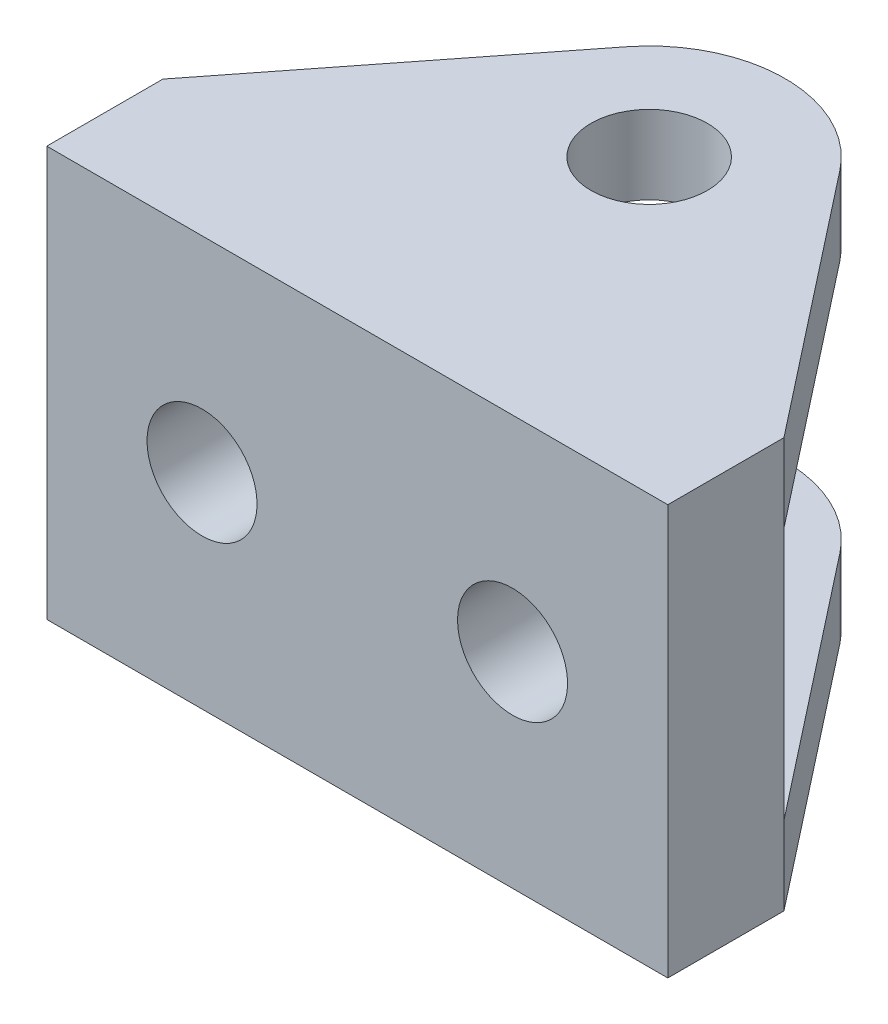
ISO-10303-21;
HEADER;
FILE_DESCRIPTION(('STEP AP214'),'2;1');
FILE_NAME('part.step','',(''),(''),'','','');
FILE_SCHEMA(('AUTOMOTIVE_DESIGN { 1 0 10303 214 1 1 1 1 }'));
ENDSEC;
DATA;
#1=APPLICATION_CONTEXT('core data for automotive mechanical design processes');
#2=APPLICATION_PROTOCOL_DEFINITION('international standard','automotive_design',2000,#1);
#3=PRODUCT_CONTEXT('',#1,'mechanical');
#4=PRODUCT('Part','Part','',(#3));
#5=PRODUCT_RELATED_PRODUCT_CATEGORY('part','',(#4));
#6=PRODUCT_DEFINITION_FORMATION('','',#4);
#7=PRODUCT_DEFINITION_CONTEXT('part definition',#1,'design');
#8=PRODUCT_DEFINITION('design','',#6,#7);
#9=PRODUCT_DEFINITION_SHAPE('','',#8);
#10=(LENGTH_UNIT() NAMED_UNIT(*) SI_UNIT(.MILLI.,.METRE.));
#11=(NAMED_UNIT(*) PLANE_ANGLE_UNIT() SI_UNIT($,.RADIAN.));
#12=(NAMED_UNIT(*) SI_UNIT($,.STERADIAN.) SOLID_ANGLE_UNIT());
#13=UNCERTAINTY_MEASURE_WITH_UNIT(LENGTH_MEASURE(1.E-05),#10,'distance_accuracy_value','');
#14=(GEOMETRIC_REPRESENTATION_CONTEXT(3) GLOBAL_UNCERTAINTY_ASSIGNED_CONTEXT((#13)) GLOBAL_UNIT_ASSIGNED_CONTEXT((#10,
#11,#12)) REPRESENTATION_CONTEXT('',''));
#15=CARTESIAN_POINT('',(0.,0.,0.));
#16=DIRECTION('',(0.,0.,1.));
#17=DIRECTION('',(1.,0.,0.));
#18=AXIS2_PLACEMENT_3D('',#15,#16,#17);
#19=CARTESIAN_POINT('',(50.8,33.528,-9.4996));
#20=DIRECTION('',(-0.78682308880433,0.,0.617178602127791));
#21=DIRECTION('',(0.617178602127791,0.,0.786823088804329));
#22=AXIS2_PLACEMENT_3D('',#19,#20,#21);
#23=PLANE('',#22);
#24=DIRECTION('',(0.,-1.,0.));
#25=VECTOR('',#24,1.);
#26=CARTESIAN_POINT('',(50.8,33.528,-9.4996));
#27=LINE('',#26,#25);
#28=CARTESIAN_POINT('',(50.8,33.528,-9.4996));
#29=VERTEX_POINT('',#28);
#30=CARTESIAN_POINT('',(50.8,27.1145,-9.4996));
#31=VERTEX_POINT('',#30);
#32=EDGE_CURVE('E165',#29,#31,#27,.T.);
#33=ORIENTED_EDGE('',*,*,#32,.T.);
#34=DIRECTION('',(-0.617178602127791,0.,-0.786823088804329));
#35=VECTOR('',#34,1.);
#36=CARTESIAN_POINT('',(50.8,27.1145,-9.4996));
#37=LINE('',#36,#35);
#38=CARTESIAN_POINT('',(34.1435715743381,27.1145,-30.7343972161451));
#39=VERTEX_POINT('',#38);
#40=EDGE_CURVE('E130',#31,#39,#37,.T.);
#41=ORIENTED_EDGE('',*,*,#40,.T.);
#42=DIRECTION('',(0.,-1.,0.));
#43=VECTOR('',#42,1.);
#44=CARTESIAN_POINT('',(34.1435715743381,33.528,-30.7343972161451));
#45=LINE('',#44,#43);
#46=CARTESIAN_POINT('',(34.1435715743381,33.528,-30.7343972161451));
#47=VERTEX_POINT('',#46);
#48=EDGE_CURVE('E128',#47,#39,#45,.T.);
#49=ORIENTED_EDGE('',*,*,#48,.F.);
#50=DIRECTION('',(-0.617178602127791,0.,-0.78682308880433));
#51=VECTOR('',#50,1.);
#52=CARTESIAN_POINT('',(50.8,33.528,-9.4996));
#53=LINE('',#52,#51);
#54=EDGE_CURVE('E113',#29,#47,#53,.T.);
#55=ORIENTED_EDGE('',*,*,#54,.F.);
#56=EDGE_LOOP('',(#33,#41,#49,#55));
#57=FACE_BOUND('',#56,.T.);
#58=ADVANCED_FACE('F42',(#57),#23,.F.);
#59=CARTESIAN_POINT('',(25.4,33.528,-23.876));
#60=DIRECTION('',(0.,-1.,0.));
#61=DIRECTION('',(0.,0.,-1.));
#62=AXIS2_PLACEMENT_3D('',#59,#60,#61);
#63=CYLINDRICAL_SURFACE('',#62,11.1125);
#64=CARTESIAN_POINT('',(25.4,27.1145,-23.876));
#65=DIRECTION('',(0.,1.,0.));
#66=DIRECTION('',(0.,0.,1.));
#67=AXIS2_PLACEMENT_3D('',#64,#65,#66);
#68=CIRCLE('',#67,11.1125);
#69=CARTESIAN_POINT('',(16.6564284256619,27.1145,-30.7343972161451));
#70=VERTEX_POINT('',#69);
#71=EDGE_CURVE('E196',#39,#70,#68,.T.);
#72=ORIENTED_EDGE('',*,*,#71,.T.);
#73=DIRECTION('',(0.,-1.,0.));
#74=VECTOR('',#73,1.);
#75=CARTESIAN_POINT('',(16.6564284256619,33.528,-30.7343972161451));
#76=LINE('',#75,#74);
#77=CARTESIAN_POINT('',(16.6564284256619,33.528,-30.7343972161451));
#78=VERTEX_POINT('',#77);
#79=EDGE_CURVE('E138',#78,#70,#76,.T.);
#80=ORIENTED_EDGE('',*,*,#79,.F.);
#81=CARTESIAN_POINT('',(25.4,33.528,-23.876));
#82=DIRECTION('',(0.,1.,0.));
#83=DIRECTION('',(0.,0.,1.));
#84=AXIS2_PLACEMENT_3D('',#81,#82,#83);
#85=CIRCLE('',#84,11.1125);
#86=EDGE_CURVE('E118',#47,#78,#85,.T.);
#87=ORIENTED_EDGE('',*,*,#86,.F.);
#88=ORIENTED_EDGE('',*,*,#48,.T.);
#89=EDGE_LOOP('',(#72,#80,#87,#88));
#90=FACE_BOUND('',#89,.T.);
#91=ADVANCED_FACE('F136',(#90),#63,.T.);
#92=CARTESIAN_POINT('',(0.,33.528,-9.4996));
#93=DIRECTION('',(0.786823088804329,0.,0.617178602127791));
#94=DIRECTION('',(0.617178602127791,0.,-0.786823088804329));
#95=AXIS2_PLACEMENT_3D('',#92,#93,#94);
#96=PLANE('',#95);
#97=ORIENTED_EDGE('',*,*,#79,.T.);
#98=DIRECTION('',(-0.617178602127791,0.,0.786823088804329));
#99=VECTOR('',#98,1.);
#100=CARTESIAN_POINT('',(0.,27.1145,-9.4996));
#101=LINE('',#100,#99);
#102=CARTESIAN_POINT('',(0.,27.1145,-9.49959999999996));
#103=VERTEX_POINT('',#102);
#104=EDGE_CURVE('E193',#70,#103,#101,.T.);
#105=ORIENTED_EDGE('',*,*,#104,.T.);
#106=DIRECTION('',(0.,-1.,0.));
#107=VECTOR('',#106,1.);
#108=CARTESIAN_POINT('',(0.,33.528,-9.4996));
#109=LINE('',#108,#107);
#110=CARTESIAN_POINT('',(0.,33.528,-9.4996));
#111=VERTEX_POINT('',#110);
#112=EDGE_CURVE('E160',#111,#103,#109,.T.);
#113=ORIENTED_EDGE('',*,*,#112,.F.);
#114=DIRECTION('',(-0.617178602127791,0.,0.786823088804329));
#115=VECTOR('',#114,1.);
#116=CARTESIAN_POINT('',(0.,33.528,-9.4996));
#117=LINE('',#116,#115);
#118=EDGE_CURVE('E68',#78,#111,#117,.T.);
#119=ORIENTED_EDGE('',*,*,#118,.F.);
#120=EDGE_LOOP('',(#97,#105,#113,#119));
#121=FACE_BOUND('',#120,.T.);
#122=ADVANCED_FACE('F229',(#121),#96,.F.);
#123=CARTESIAN_POINT('',(25.4,33.528,-23.876));
#124=DIRECTION('',(0.,-1.,0.));
#125=DIRECTION('',(0.,0.,-1.));
#126=AXIS2_PLACEMENT_3D('',#123,#124,#125);
#127=CYLINDRICAL_SURFACE('',#126,4.7625);
#128=CARTESIAN_POINT('',(25.4,27.1145,-23.876));
#129=DIRECTION('',(0.,1.,0.));
#130=DIRECTION('',(0.,0.,1.));
#131=AXIS2_PLACEMENT_3D('',#128,#129,#130);
#132=CIRCLE('',#131,4.7625);
#133=CARTESIAN_POINT('',(25.4,27.1145,-19.1135));
#134=VERTEX_POINT('',#133);
#135=EDGE_CURVE('E46',#134,#134,#132,.T.);
#136=ORIENTED_EDGE('',*,*,#135,.F.);
#137=EDGE_LOOP('',(#136));
#138=FACE_BOUND('',#137,.T.);
#139=CARTESIAN_POINT('',(25.4,33.528,-23.876));
#140=DIRECTION('',(0.,1.,0.));
#141=DIRECTION('',(0.,0.,1.));
#142=AXIS2_PLACEMENT_3D('',#139,#140,#141);
#143=CIRCLE('',#142,4.7625);
#144=CARTESIAN_POINT('',(25.4,33.528,-19.1135));
#145=VERTEX_POINT('',#144);
#146=EDGE_CURVE('E146',#145,#145,#143,.T.);
#147=ORIENTED_EDGE('',*,*,#146,.T.);
#148=EDGE_LOOP('',(#147));
#149=FACE_BOUND('',#148,.T.);
#150=ADVANCED_FACE('F309',(#138,#149),#127,.F.);
#151=CARTESIAN_POINT('',(25.4,33.528,-23.876));
#152=DIRECTION('',(0.,1.,0.));
#153=DIRECTION('',(0.,0.,1.));
#154=AXIS2_PLACEMENT_3D('',#151,#152,#153);
#155=PLANE('',#154);
#156=DIRECTION('',(0.,0.,1.));
#157=VECTOR('',#156,1.);
#158=CARTESIAN_POINT('',(0.,33.528,0.));
#159=LINE('',#158,#157);
#160=CARTESIAN_POINT('',(0.,33.528,0.));
#161=VERTEX_POINT('',#160);
#162=EDGE_CURVE('E159',#111,#161,#159,.T.);
#163=ORIENTED_EDGE('',*,*,#162,.T.);
#164=DIRECTION('',(1.,0.,0.));
#165=VECTOR('',#164,1.);
#166=CARTESIAN_POINT('',(0.,33.528,0.));
#167=LINE('',#166,#165);
#168=CARTESIAN_POINT('',(50.8,33.528,0.));
#169=VERTEX_POINT('',#168);
#170=EDGE_CURVE('E104',#161,#169,#167,.T.);
#171=ORIENTED_EDGE('',*,*,#170,.T.);
#172=DIRECTION('',(0.,0.,-1.));
#173=VECTOR('',#172,1.);
#174=CARTESIAN_POINT('',(50.8,33.528,0.));
#175=LINE('',#174,#173);
#176=EDGE_CURVE('E121',#169,#29,#175,.T.);
#177=ORIENTED_EDGE('',*,*,#176,.T.);
#178=ORIENTED_EDGE('',*,*,#54,.T.);
#179=ORIENTED_EDGE('',*,*,#86,.T.);
#180=ORIENTED_EDGE('',*,*,#118,.T.);
#181=EDGE_LOOP('',(#163,#171,#177,#178,#179,#180));
#182=FACE_BOUND('',#181,.T.);
#183=ORIENTED_EDGE('',*,*,#146,.F.);
#184=EDGE_LOOP('',(#183));
#185=FACE_BOUND('',#184,.T.);
#186=ADVANCED_FACE('F115',(#182,#185),#155,.T.);
#187=CARTESIAN_POINT('',(25.4,0.,-23.876));
#188=DIRECTION('',(0.,1.,0.));
#189=DIRECTION('',(0.,0.,1.));
#190=AXIS2_PLACEMENT_3D('',#187,#188,#189);
#191=PLANE('',#190);
#192=DIRECTION('',(0.,0.,1.));
#193=VECTOR('',#192,1.);
#194=CARTESIAN_POINT('',(0.,0.,0.));
#195=LINE('',#194,#193);
#196=CARTESIAN_POINT('',(0.,0.,-9.4996));
#197=VERTEX_POINT('',#196);
#198=CARTESIAN_POINT('',(0.,0.,0.));
#199=VERTEX_POINT('',#198);
#200=EDGE_CURVE('E143',#197,#199,#195,.T.);
#201=ORIENTED_EDGE('',*,*,#200,.F.);
#202=DIRECTION('',(-0.617178602127791,0.,0.786823088804329));
#203=VECTOR('',#202,1.);
#204=CARTESIAN_POINT('',(0.,0.,-9.4996));
#205=LINE('',#204,#203);
#206=CARTESIAN_POINT('',(16.6564284256619,0.,-30.7343972161451));
#207=VERTEX_POINT('',#206);
#208=EDGE_CURVE('E157',#207,#197,#205,.T.);
#209=ORIENTED_EDGE('',*,*,#208,.F.);
#210=CARTESIAN_POINT('',(25.4,0.,-23.876));
#211=DIRECTION('',(0.,1.,0.));
#212=DIRECTION('',(0.,0.,1.));
#213=AXIS2_PLACEMENT_3D('',#210,#211,#212);
#214=CIRCLE('',#213,11.1125);
#215=CARTESIAN_POINT('',(34.1435715743381,0.,-30.7343972161451));
#216=VERTEX_POINT('',#215);
#217=EDGE_CURVE('E154',#216,#207,#214,.T.);
#218=ORIENTED_EDGE('',*,*,#217,.F.);
#219=DIRECTION('',(-0.617178602127791,0.,-0.78682308880433));
#220=VECTOR('',#219,1.);
#221=CARTESIAN_POINT('',(50.8,0.,-9.4996));
#222=LINE('',#221,#220);
#223=CARTESIAN_POINT('',(50.8,0.,-9.4996));
#224=VERTEX_POINT('',#223);
#225=EDGE_CURVE('E151',#224,#216,#222,.T.);
#226=ORIENTED_EDGE('',*,*,#225,.F.);
#227=DIRECTION('',(0.,0.,-1.));
#228=VECTOR('',#227,1.);
#229=CARTESIAN_POINT('',(50.8,0.,0.));
#230=LINE('',#229,#228);
#231=CARTESIAN_POINT('',(50.8,0.,0.));
#232=VERTEX_POINT('',#231);
#233=EDGE_CURVE('E148',#232,#224,#230,.T.);
#234=ORIENTED_EDGE('',*,*,#233,.F.);
#235=DIRECTION('',(1.,0.,0.));
#236=VECTOR('',#235,1.);
#237=CARTESIAN_POINT('',(0.,0.,0.));
#238=LINE('',#237,#236);
#239=EDGE_CURVE('E145',#199,#232,#238,.T.);
#240=ORIENTED_EDGE('',*,*,#239,.F.);
#241=EDGE_LOOP('',(#201,#209,#218,#226,#234,#240));
#242=FACE_BOUND('',#241,.T.);
#243=CARTESIAN_POINT('',(25.4,0.,-23.876));
#244=DIRECTION('',(0.,1.,0.));
#245=DIRECTION('',(0.,0.,1.));
#246=AXIS2_PLACEMENT_3D('',#243,#244,#245);
#247=CIRCLE('',#246,4.7625);
#248=CARTESIAN_POINT('',(25.4,0.,-19.1135));
#249=VERTEX_POINT('',#248);
#250=EDGE_CURVE('E199',#249,#249,#247,.T.);
#251=ORIENTED_EDGE('',*,*,#250,.T.);
#252=EDGE_LOOP('',(#251));
#253=FACE_BOUND('',#252,.T.);
#254=ADVANCED_FACE('F233',(#242,#253),#191,.F.);
#255=CARTESIAN_POINT('',(0.,33.528,0.));
#256=DIRECTION('',(1.,0.,0.));
#257=DIRECTION('',(0.,0.,-1.));
#258=AXIS2_PLACEMENT_3D('',#255,#256,#257);
#259=PLANE('',#258);
#260=ORIENTED_EDGE('',*,*,#200,.T.);
#261=DIRECTION('',(0.,-1.,0.));
#262=VECTOR('',#261,1.);
#263=CARTESIAN_POINT('',(0.,33.528,0.));
#264=LINE('',#263,#262);
#265=EDGE_CURVE('E11',#161,#199,#264,.T.);
#266=ORIENTED_EDGE('',*,*,#265,.F.);
#267=ORIENTED_EDGE('',*,*,#162,.F.);
#268=ORIENTED_EDGE('',*,*,#112,.T.);
#269=DIRECTION('',(0.,-1.,0.));
#270=VECTOR('',#269,1.);
#271=CARTESIAN_POINT('',(0.,16.764,-9.49959999999997));
#272=LINE('',#271,#270);
#273=CARTESIAN_POINT('',(0.,6.4135,-9.4996));
#274=VERTEX_POINT('',#273);
#275=EDGE_CURVE('E182',#103,#274,#272,.T.);
#276=ORIENTED_EDGE('',*,*,#275,.T.);
#277=EDGE_CURVE('E96',#274,#197,#109,.T.);
#278=ORIENTED_EDGE('',*,*,#277,.T.);
#279=EDGE_LOOP('',(#260,#266,#267,#268,#276,#278));
#280=FACE_BOUND('',#279,.T.);
#281=ADVANCED_FACE('F44',(#280),#259,.F.);
#282=CARTESIAN_POINT('',(0.,33.528,0.));
#283=DIRECTION('',(0.,0.,-1.));
#284=DIRECTION('',(-1.,0.,0.));
#285=AXIS2_PLACEMENT_3D('',#282,#283,#284);
#286=PLANE('',#285);
#287=CARTESIAN_POINT('',(38.1,16.764,0.));
#288=DIRECTION('',(0.,0.,-1.));
#289=DIRECTION('',(-1.,0.,0.));
#290=AXIS2_PLACEMENT_3D('',#287,#288,#289);
#291=CIRCLE('',#290,4.5);
#292=CARTESIAN_POINT('',(33.6,16.764,0.));
#293=VERTEX_POINT('',#292);
#294=EDGE_CURVE('E247',#293,#293,#291,.F.);
#295=ORIENTED_EDGE('',*,*,#294,.F.);
#296=EDGE_LOOP('',(#295));
#297=FACE_BOUND('',#296,.T.);
#298=CARTESIAN_POINT('',(12.7,16.764,0.));
#299=DIRECTION('',(0.,0.,-1.));
#300=DIRECTION('',(-1.,0.,0.));
#301=AXIS2_PLACEMENT_3D('',#298,#299,#300);
#302=CIRCLE('',#301,4.5);
#303=CARTESIAN_POINT('',(8.2,16.764,0.));
#304=VERTEX_POINT('',#303);
#305=EDGE_CURVE('E253',#304,#304,#302,.F.);
#306=ORIENTED_EDGE('',*,*,#305,.F.);
#307=EDGE_LOOP('',(#306));
#308=FACE_BOUND('',#307,.T.);
#309=ORIENTED_EDGE('',*,*,#239,.T.);
#310=DIRECTION('',(0.,-1.,0.));
#311=VECTOR('',#310,1.);
#312=CARTESIAN_POINT('',(50.8,33.528,0.));
#313=LINE('',#312,#311);
#314=EDGE_CURVE('E51',#169,#232,#313,.T.);
#315=ORIENTED_EDGE('',*,*,#314,.F.);
#316=ORIENTED_EDGE('',*,*,#170,.F.);
#317=ORIENTED_EDGE('',*,*,#265,.T.);
#318=EDGE_LOOP('',(#309,#315,#316,#317));
#319=FACE_BOUND('',#318,.T.);
#320=ADVANCED_FACE('F207',(#297,#308,#319),#286,.F.);
#321=CARTESIAN_POINT('',(50.8,33.528,0.));
#322=DIRECTION('',(-1.,0.,0.));
#323=DIRECTION('',(0.,0.,1.));
#324=AXIS2_PLACEMENT_3D('',#321,#322,#323);
#325=PLANE('',#324);
#326=ORIENTED_EDGE('',*,*,#233,.T.);
#327=CARTESIAN_POINT('',(50.8,6.4135,-9.4996));
#328=VERTEX_POINT('',#327);
#329=EDGE_CURVE('E133',#328,#224,#27,.T.);
#330=ORIENTED_EDGE('',*,*,#329,.F.);
#331=DIRECTION('',(0.,-1.,0.));
#332=VECTOR('',#331,1.);
#333=CARTESIAN_POINT('',(50.8,16.764,-9.4996));
#334=LINE('',#333,#332);
#335=EDGE_CURVE('E185',#31,#328,#334,.T.);
#336=ORIENTED_EDGE('',*,*,#335,.F.);
#337=ORIENTED_EDGE('',*,*,#32,.F.);
#338=ORIENTED_EDGE('',*,*,#176,.F.);
#339=ORIENTED_EDGE('',*,*,#314,.T.);
#340=EDGE_LOOP('',(#326,#330,#336,#337,#338,#339));
#341=FACE_BOUND('',#340,.T.);
#342=ADVANCED_FACE('F210',(#341),#325,.F.);
#343=CARTESIAN_POINT('',(34.1435715743381,6.4135,-30.7343972161451));
#344=VERTEX_POINT('',#343);
#345=EDGE_CURVE('E134',#344,#216,#45,.T.);
#346=ORIENTED_EDGE('',*,*,#345,.F.);
#347=DIRECTION('',(0.617178602127791,0.,0.786823088804329));
#348=VECTOR('',#347,1.);
#349=CARTESIAN_POINT('',(50.8,6.4135,-9.4996));
#350=LINE('',#349,#348);
#351=EDGE_CURVE('E190',#344,#328,#350,.T.);
#352=ORIENTED_EDGE('',*,*,#351,.T.);
#353=ORIENTED_EDGE('',*,*,#329,.T.);
#354=ORIENTED_EDGE('',*,*,#225,.T.);
#355=EDGE_LOOP('',(#346,#352,#353,#354));
#356=FACE_BOUND('',#355,.T.);
#357=ADVANCED_FACE('F239',(#356),#23,.F.);
#358=CARTESIAN_POINT('',(16.6564284256619,6.4135,-30.7343972161451));
#359=VERTEX_POINT('',#358);
#360=EDGE_CURVE('E163',#359,#207,#76,.T.);
#361=ORIENTED_EDGE('',*,*,#360,.F.);
#362=CARTESIAN_POINT('',(25.4,6.4135,-23.876));
#363=DIRECTION('',(0.,-1.,0.));
#364=DIRECTION('',(0.,0.,-1.));
#365=AXIS2_PLACEMENT_3D('',#362,#363,#364);
#366=CIRCLE('',#365,11.1125);
#367=EDGE_CURVE('E175',#359,#344,#366,.T.);
#368=ORIENTED_EDGE('',*,*,#367,.T.);
#369=ORIENTED_EDGE('',*,*,#345,.T.);
#370=ORIENTED_EDGE('',*,*,#217,.T.);
#371=EDGE_LOOP('',(#361,#368,#369,#370));
#372=FACE_BOUND('',#371,.T.);
#373=ADVANCED_FACE('F244',(#372),#63,.T.);
#374=ORIENTED_EDGE('',*,*,#277,.F.);
#375=DIRECTION('',(0.617178602127791,0.,-0.786823088804329));
#376=VECTOR('',#375,1.);
#377=CARTESIAN_POINT('',(0.,6.4135,-9.4996));
#378=LINE('',#377,#376);
#379=EDGE_CURVE('E170',#274,#359,#378,.T.);
#380=ORIENTED_EDGE('',*,*,#379,.T.);
#381=ORIENTED_EDGE('',*,*,#360,.T.);
#382=ORIENTED_EDGE('',*,*,#208,.T.);
#383=EDGE_LOOP('',(#374,#380,#381,#382));
#384=FACE_BOUND('',#383,.T.);
#385=ADVANCED_FACE('F246',(#384),#96,.F.);
#386=CARTESIAN_POINT('',(25.4,6.4135,-23.876));
#387=DIRECTION('',(0.,-1.,0.));
#388=DIRECTION('',(0.,0.,-1.));
#389=AXIS2_PLACEMENT_3D('',#386,#387,#388);
#390=CIRCLE('',#389,4.7625);
#391=CARTESIAN_POINT('',(25.4,6.4135,-28.6385));
#392=VERTEX_POINT('',#391);
#393=EDGE_CURVE('E168',#392,#392,#390,.T.);
#394=ORIENTED_EDGE('',*,*,#393,.F.);
#395=EDGE_LOOP('',(#394));
#396=FACE_BOUND('',#395,.T.);
#397=ORIENTED_EDGE('',*,*,#250,.F.);
#398=EDGE_LOOP('',(#397));
#399=FACE_BOUND('',#398,.T.);
#400=ADVANCED_FACE('F314',(#396,#399),#127,.F.);
#401=CARTESIAN_POINT('',(0.,27.1145,-9.49959999999996));
#402=DIRECTION('',(0.,1.,0.));
#403=DIRECTION('',(0.,0.,1.));
#404=AXIS2_PLACEMENT_3D('',#401,#402,#403);
#405=PLANE('',#404);
#406=ORIENTED_EDGE('',*,*,#135,.T.);
#407=EDGE_LOOP('',(#406));
#408=FACE_BOUND('',#407,.T.);
#409=DIRECTION('',(1.,0.,0.));
#410=VECTOR('',#409,1.);
#411=CARTESIAN_POINT('',(0.,27.1145,-9.49959999999996));
#412=LINE('',#411,#410);
#413=EDGE_CURVE('E171',#103,#31,#412,.T.);
#414=ORIENTED_EDGE('',*,*,#413,.F.);
#415=ORIENTED_EDGE('',*,*,#104,.F.);
#416=ORIENTED_EDGE('',*,*,#71,.F.);
#417=ORIENTED_EDGE('',*,*,#40,.F.);
#418=EDGE_LOOP('',(#414,#415,#416,#417));
#419=FACE_BOUND('',#418,.T.);
#420=ADVANCED_FACE('F227',(#408,#419),#405,.F.);
#421=CARTESIAN_POINT('',(0.,6.4135,-9.49959999999996));
#422=DIRECTION('',(0.,-1.,0.));
#423=DIRECTION('',(0.,0.,-1.));
#424=AXIS2_PLACEMENT_3D('',#421,#422,#423);
#425=PLANE('',#424);
#426=ORIENTED_EDGE('',*,*,#393,.T.);
#427=EDGE_LOOP('',(#426));
#428=FACE_BOUND('',#427,.T.);
#429=ORIENTED_EDGE('',*,*,#367,.F.);
#430=ORIENTED_EDGE('',*,*,#379,.F.);
#431=DIRECTION('',(1.,0.,0.));
#432=VECTOR('',#431,1.);
#433=CARTESIAN_POINT('',(0.,6.4135,-9.49959999999996));
#434=LINE('',#433,#432);
#435=EDGE_CURVE('E59',#274,#328,#434,.T.);
#436=ORIENTED_EDGE('',*,*,#435,.T.);
#437=ORIENTED_EDGE('',*,*,#351,.F.);
#438=EDGE_LOOP('',(#429,#430,#436,#437));
#439=FACE_BOUND('',#438,.T.);
#440=ADVANCED_FACE('F241',(#428,#439),#425,.F.);
#441=CARTESIAN_POINT('',(0.,16.764,-9.49959999999997));
#442=DIRECTION('',(0.,0.,1.));
#443=DIRECTION('',(1.,0.,0.));
#444=AXIS2_PLACEMENT_3D('',#441,#442,#443);
#445=PLANE('',#444);
#446=CARTESIAN_POINT('',(38.1,16.764,-9.49959999999999));
#447=DIRECTION('',(0.,0.,-1.));
#448=DIRECTION('',(-1.,0.,0.));
#449=AXIS2_PLACEMENT_3D('',#446,#447,#448);
#450=CIRCLE('',#449,4.5);
#451=CARTESIAN_POINT('',(33.6,16.764,-9.49959999999999));
#452=VERTEX_POINT('',#451);
#453=EDGE_CURVE('E252',#452,#452,#450,.T.);
#454=ORIENTED_EDGE('',*,*,#453,.F.);
#455=EDGE_LOOP('',(#454));
#456=FACE_BOUND('',#455,.T.);
#457=CARTESIAN_POINT('',(12.7,16.764,-9.49959999999997));
#458=DIRECTION('',(0.,0.,-1.));
#459=DIRECTION('',(-1.,0.,0.));
#460=AXIS2_PLACEMENT_3D('',#457,#458,#459);
#461=CIRCLE('',#460,4.5);
#462=CARTESIAN_POINT('',(8.2,16.764,-9.49959999999997));
#463=VERTEX_POINT('',#462);
#464=EDGE_CURVE('E249',#463,#463,#461,.T.);
#465=ORIENTED_EDGE('',*,*,#464,.F.);
#466=EDGE_LOOP('',(#465));
#467=FACE_BOUND('',#466,.T.);
#468=ORIENTED_EDGE('',*,*,#335,.T.);
#469=ORIENTED_EDGE('',*,*,#435,.F.);
#470=ORIENTED_EDGE('',*,*,#275,.F.);
#471=ORIENTED_EDGE('',*,*,#413,.T.);
#472=EDGE_LOOP('',(#468,#469,#470,#471));
#473=FACE_BOUND('',#472,.T.);
#474=ADVANCED_FACE('F263',(#456,#467,#473),#445,.F.);
#475=CARTESIAN_POINT('',(12.7,16.764,12.7279220613579));
#476=DIRECTION('',(0.,0.,-1.));
#477=DIRECTION('',(-1.,0.,0.));
#478=AXIS2_PLACEMENT_3D('',#475,#476,#477);
#479=CYLINDRICAL_SURFACE('',#478,4.5);
#480=ORIENTED_EDGE('',*,*,#305,.T.);
#481=EDGE_LOOP('',(#480));
#482=FACE_BOUND('',#481,.T.);
#483=ORIENTED_EDGE('',*,*,#464,.T.);
#484=EDGE_LOOP('',(#483));
#485=FACE_BOUND('',#484,.T.);
#486=ADVANCED_FACE('F266',(#482,#485),#479,.F.);
#487=CARTESIAN_POINT('',(38.1,16.764,12.7279220613578));
#488=DIRECTION('',(0.,0.,-1.));
#489=DIRECTION('',(-1.,0.,0.));
#490=AXIS2_PLACEMENT_3D('',#487,#488,#489);
#491=CYLINDRICAL_SURFACE('',#490,4.5);
#492=ORIENTED_EDGE('',*,*,#294,.T.);
#493=EDGE_LOOP('',(#492));
#494=FACE_BOUND('',#493,.T.);
#495=ORIENTED_EDGE('',*,*,#453,.T.);
#496=EDGE_LOOP('',(#495));
#497=FACE_BOUND('',#496,.T.);
#498=ADVANCED_FACE('F261',(#494,#497),#491,.F.);
#499=CLOSED_SHELL('',(#58,#91,#122,#150,#186,#254,#281,#320,#342,#357,#373,#385,#400,#420,#440,
#474,#486,#498));
#500=MANIFOLD_SOLID_BREP('B2',#499);
#501=ADVANCED_BREP_SHAPE_REPRESENTATION('',(#18,#500),#14);
#502=SHAPE_DEFINITION_REPRESENTATION(#9,#501);
ENDSEC;
END-ISO-10303-21;
